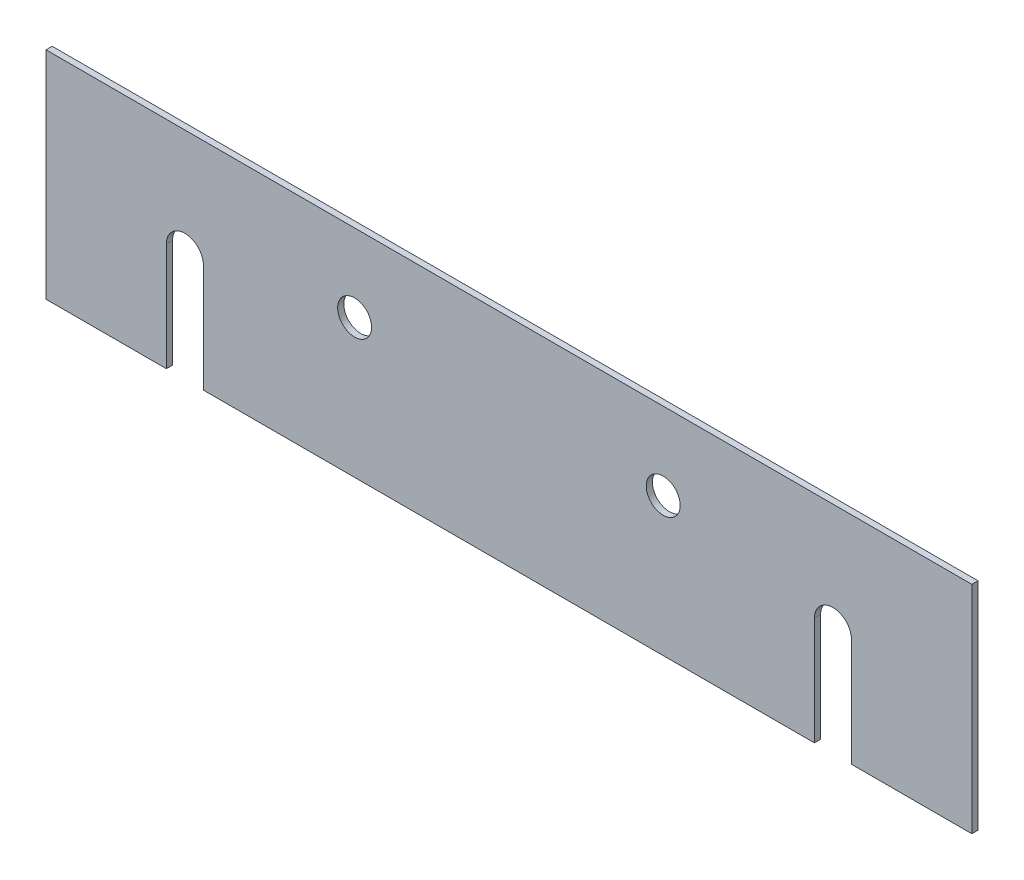
ISO-10303-21;
HEADER;
FILE_DESCRIPTION(('STEP AP214'),'2;1');
FILE_NAME('part.step','',(''),(''),'','','');
FILE_SCHEMA(('AUTOMOTIVE_DESIGN { 1 0 10303 214 1 1 1 1 }'));
ENDSEC;
DATA;
#1=APPLICATION_CONTEXT('core data for automotive mechanical design processes');
#2=APPLICATION_PROTOCOL_DEFINITION('international standard','automotive_design',2000,#1);
#3=PRODUCT_CONTEXT('',#1,'mechanical');
#4=PRODUCT('Part','Part','',(#3));
#5=PRODUCT_RELATED_PRODUCT_CATEGORY('part','',(#4));
#6=PRODUCT_DEFINITION_FORMATION('','',#4);
#7=PRODUCT_DEFINITION_CONTEXT('part definition',#1,'design');
#8=PRODUCT_DEFINITION('design','',#6,#7);
#9=PRODUCT_DEFINITION_SHAPE('','',#8);
#10=(LENGTH_UNIT() NAMED_UNIT(*) SI_UNIT(.MILLI.,.METRE.));
#11=(NAMED_UNIT(*) PLANE_ANGLE_UNIT() SI_UNIT($,.RADIAN.));
#12=(NAMED_UNIT(*) SI_UNIT($,.STERADIAN.) SOLID_ANGLE_UNIT());
#13=UNCERTAINTY_MEASURE_WITH_UNIT(LENGTH_MEASURE(1.E-05),#10,'distance_accuracy_value','');
#14=(GEOMETRIC_REPRESENTATION_CONTEXT(3) GLOBAL_UNCERTAINTY_ASSIGNED_CONTEXT((#13)) GLOBAL_UNIT_ASSIGNED_CONTEXT((#10,
#11,#12)) REPRESENTATION_CONTEXT('',''));
#15=CARTESIAN_POINT('',(0.,0.,0.));
#16=DIRECTION('',(0.,0.,1.));
#17=DIRECTION('',(1.,0.,0.));
#18=AXIS2_PLACEMENT_3D('',#15,#16,#17);
#19=CARTESIAN_POINT('',(58.1800411522634,11.4197530864197,2.));
#20=DIRECTION('',(0.,0.,1.));
#21=DIRECTION('',(1.,0.,0.));
#22=AXIS2_PLACEMENT_3D('',#19,#20,#21);
#23=PLANE('',#22);
#24=CARTESIAN_POINT('',(-96.8199588477366,21.2962962962963,2.));
#25=DIRECTION('',(0.,0.,1.));
#26=DIRECTION('',(1.,0.,0.));
#27=AXIS2_PLACEMENT_3D('',#24,#25,#26);
#28=CIRCLE('',#27,5.5);
#29=CARTESIAN_POINT('',(-91.3199588477366,21.2962962962963,2.));
#30=VERTEX_POINT('',#29);
#31=EDGE_CURVE('E157',#30,#30,#28,.T.);
#32=ORIENTED_EDGE('',*,*,#31,.F.);
#33=EDGE_LOOP('',(#32));
#34=FACE_BOUND('',#33,.T.);
#35=DIRECTION('',(0.,1.,0.));
#36=VECTOR('',#35,1.);
#37=CARTESIAN_POINT('',(103.180041152263,46.4197530864198,2.));
#38=LINE('',#37,#36);
#39=CARTESIAN_POINT('',(103.180041152263,-23.5802469135802,2.));
#40=VERTEX_POINT('',#39);
#41=CARTESIAN_POINT('',(103.180041152263,46.4197530864198,2.));
#42=VERTEX_POINT('',#41);
#43=EDGE_CURVE('E176',#40,#42,#38,.T.);
#44=ORIENTED_EDGE('',*,*,#43,.T.);
#45=DIRECTION('',(-1.,0.,0.));
#46=VECTOR('',#45,1.);
#47=CARTESIAN_POINT('',(103.180041152263,46.4197530864198,2.));
#48=LINE('',#47,#46);
#49=CARTESIAN_POINT('',(-196.819958847737,46.4197530864197,2.));
#50=VERTEX_POINT('',#49);
#51=EDGE_CURVE('E104',#42,#50,#48,.T.);
#52=ORIENTED_EDGE('',*,*,#51,.T.);
#53=DIRECTION('',(0.,-1.,0.));
#54=VECTOR('',#53,1.);
#55=CARTESIAN_POINT('',(-196.819958847737,46.4197530864197,2.));
#56=LINE('',#55,#54);
#57=CARTESIAN_POINT('',(-196.819958847737,-23.5802469135803,2.));
#58=VERTEX_POINT('',#57);
#59=EDGE_CURVE('E203',#50,#58,#56,.T.);
#60=ORIENTED_EDGE('',*,*,#59,.T.);
#61=DIRECTION('',(1.,0.,0.));
#62=VECTOR('',#61,1.);
#63=CARTESIAN_POINT('',(-157.819958847737,-23.5802469135803,2.));
#64=LINE('',#63,#62);
#65=CARTESIAN_POINT('',(-157.819958847737,-23.5802469135803,2.));
#66=VERTEX_POINT('',#65);
#67=EDGE_CURVE('E222',#58,#66,#64,.T.);
#68=ORIENTED_EDGE('',*,*,#67,.T.);
#69=DIRECTION('',(0.,1.,0.));
#70=VECTOR('',#69,1.);
#71=CARTESIAN_POINT('',(-157.819958847737,-23.5802469135803,2.));
#72=LINE('',#71,#70);
#73=CARTESIAN_POINT('',(-157.819958847737,11.4197530864197,2.));
#74=VERTEX_POINT('',#73);
#75=EDGE_CURVE('E219',#66,#74,#72,.T.);
#76=ORIENTED_EDGE('',*,*,#75,.T.);
#77=CARTESIAN_POINT('',(-151.819958847737,11.4197530864197,2.));
#78=DIRECTION('',(0.,0.,-1.));
#79=DIRECTION('',(1.,0.,0.));
#80=AXIS2_PLACEMENT_3D('',#77,#78,#79);
#81=CIRCLE('',#80,6.00000000000001);
#82=CARTESIAN_POINT('',(-145.819958847737,11.4197530864197,2.));
#83=VERTEX_POINT('',#82);
#84=EDGE_CURVE('E221',#74,#83,#81,.T.);
#85=ORIENTED_EDGE('',*,*,#84,.T.);
#86=DIRECTION('',(0.,-1.,0.));
#87=VECTOR('',#86,1.);
#88=CARTESIAN_POINT('',(-145.819958847737,-23.5802469135803,2.));
#89=LINE('',#88,#87);
#90=CARTESIAN_POINT('',(-145.819958847737,-23.5802469135803,2.));
#91=VERTEX_POINT('',#90);
#92=EDGE_CURVE('E224',#83,#91,#89,.T.);
#93=ORIENTED_EDGE('',*,*,#92,.T.);
#94=DIRECTION('',(1.,0.,0.));
#95=VECTOR('',#94,1.);
#96=CARTESIAN_POINT('',(52.1800411522634,-23.5802469135803,2.));
#97=LINE('',#96,#95);
#98=CARTESIAN_POINT('',(52.1800411522634,-23.5802469135803,2.));
#99=VERTEX_POINT('',#98);
#100=EDGE_CURVE('E230',#91,#99,#97,.T.);
#101=ORIENTED_EDGE('',*,*,#100,.T.);
#102=DIRECTION('',(0.,1.,0.));
#103=VECTOR('',#102,1.);
#104=CARTESIAN_POINT('',(52.1800411522634,-23.5802469135803,2.));
#105=LINE('',#104,#103);
#106=CARTESIAN_POINT('',(52.1800411522634,11.4197530864197,2.));
#107=VERTEX_POINT('',#106);
#108=EDGE_CURVE('E135',#99,#107,#105,.T.);
#109=ORIENTED_EDGE('',*,*,#108,.T.);
#110=CARTESIAN_POINT('',(58.1800411522634,11.4197530864197,2.));
#111=DIRECTION('',(0.,0.,-1.));
#112=DIRECTION('',(1.,0.,0.));
#113=AXIS2_PLACEMENT_3D('',#110,#111,#112);
#114=CIRCLE('',#113,6.00000000000001);
#115=CARTESIAN_POINT('',(64.1800411522634,11.4197530864197,2.));
#116=VERTEX_POINT('',#115);
#117=EDGE_CURVE('E129',#107,#116,#114,.T.);
#118=ORIENTED_EDGE('',*,*,#117,.T.);
#119=DIRECTION('',(0.,-1.,0.));
#120=VECTOR('',#119,1.);
#121=CARTESIAN_POINT('',(64.1800411522634,-23.5802469135803,2.));
#122=LINE('',#121,#120);
#123=CARTESIAN_POINT('',(64.1800411522634,-23.5802469135803,2.));
#124=VERTEX_POINT('',#123);
#125=EDGE_CURVE('E133',#116,#124,#122,.T.);
#126=ORIENTED_EDGE('',*,*,#125,.T.);
#127=DIRECTION('',(1.,0.,0.));
#128=VECTOR('',#127,1.);
#129=CARTESIAN_POINT('',(103.180041152263,-23.5802469135802,2.));
#130=LINE('',#129,#128);
#131=EDGE_CURVE('E49',#124,#40,#130,.T.);
#132=ORIENTED_EDGE('',*,*,#131,.T.);
#133=EDGE_LOOP('',(#44,#52,#60,#68,#76,#85,#93,#101,#109,#118,#126,#132));
#134=FACE_BOUND('',#133,.T.);
#135=CARTESIAN_POINT('',(3.18004115226343,21.2962962962963,2.));
#136=DIRECTION('',(0.,0.,1.));
#137=DIRECTION('',(1.,0.,0.));
#138=AXIS2_PLACEMENT_3D('',#135,#136,#137);
#139=CIRCLE('',#138,5.5);
#140=CARTESIAN_POINT('',(8.68004115226343,21.2962962962963,2.));
#141=VERTEX_POINT('',#140);
#142=EDGE_CURVE('E272',#141,#141,#139,.T.);
#143=ORIENTED_EDGE('',*,*,#142,.F.);
#144=EDGE_LOOP('',(#143));
#145=FACE_BOUND('',#144,.T.);
#146=ADVANCED_FACE('F32',(#34,#134,#145),#23,.T.);
#147=CARTESIAN_POINT('',(58.1800411522634,11.4197530864197,0.));
#148=DIRECTION('',(0.,0.,1.));
#149=DIRECTION('',(1.,0.,0.));
#150=AXIS2_PLACEMENT_3D('',#147,#148,#149);
#151=PLANE('',#150);
#152=DIRECTION('',(0.,1.,0.));
#153=VECTOR('',#152,1.);
#154=CARTESIAN_POINT('',(103.180041152263,46.4197530864198,0.));
#155=LINE('',#154,#153);
#156=CARTESIAN_POINT('',(103.180041152263,-23.5802469135802,0.));
#157=VERTEX_POINT('',#156);
#158=CARTESIAN_POINT('',(103.180041152263,46.4197530864198,0.));
#159=VERTEX_POINT('',#158);
#160=EDGE_CURVE('E153',#157,#159,#155,.T.);
#161=ORIENTED_EDGE('',*,*,#160,.F.);
#162=DIRECTION('',(1.,0.,0.));
#163=VECTOR('',#162,1.);
#164=CARTESIAN_POINT('',(103.180041152263,-23.5802469135802,0.));
#165=LINE('',#164,#163);
#166=CARTESIAN_POINT('',(64.1800411522634,-23.5802469135803,0.));
#167=VERTEX_POINT('',#166);
#168=EDGE_CURVE('E96',#167,#157,#165,.T.);
#169=ORIENTED_EDGE('',*,*,#168,.F.);
#170=DIRECTION('',(0.,-1.,0.));
#171=VECTOR('',#170,1.);
#172=CARTESIAN_POINT('',(64.1800411522634,-23.5802469135803,0.));
#173=LINE('',#172,#171);
#174=CARTESIAN_POINT('',(64.1800411522634,11.4197530864197,0.));
#175=VERTEX_POINT('',#174);
#176=EDGE_CURVE('E90',#175,#167,#173,.T.);
#177=ORIENTED_EDGE('',*,*,#176,.F.);
#178=CARTESIAN_POINT('',(58.1800411522634,11.4197530864197,0.));
#179=DIRECTION('',(0.,0.,-1.));
#180=DIRECTION('',(1.,0.,0.));
#181=AXIS2_PLACEMENT_3D('',#178,#179,#180);
#182=CIRCLE('',#181,6.00000000000001);
#183=CARTESIAN_POINT('',(52.1800411522634,11.4197530864197,0.));
#184=VERTEX_POINT('',#183);
#185=EDGE_CURVE('E143',#184,#175,#182,.T.);
#186=ORIENTED_EDGE('',*,*,#185,.F.);
#187=DIRECTION('',(0.,1.,0.));
#188=VECTOR('',#187,1.);
#189=CARTESIAN_POINT('',(52.1800411522634,-23.5802469135803,0.));
#190=LINE('',#189,#188);
#191=CARTESIAN_POINT('',(52.1800411522634,-23.5802469135803,0.));
#192=VERTEX_POINT('',#191);
#193=EDGE_CURVE('E171',#192,#184,#190,.T.);
#194=ORIENTED_EDGE('',*,*,#193,.F.);
#195=DIRECTION('',(1.,0.,0.));
#196=VECTOR('',#195,1.);
#197=CARTESIAN_POINT('',(52.1800411522634,-23.5802469135803,0.));
#198=LINE('',#197,#196);
#199=CARTESIAN_POINT('',(-145.819958847737,-23.5802469135803,0.));
#200=VERTEX_POINT('',#199);
#201=EDGE_CURVE('E169',#200,#192,#198,.T.);
#202=ORIENTED_EDGE('',*,*,#201,.F.);
#203=DIRECTION('',(0.,-1.,0.));
#204=VECTOR('',#203,1.);
#205=CARTESIAN_POINT('',(-145.819958847737,-23.5802469135803,0.));
#206=LINE('',#205,#204);
#207=CARTESIAN_POINT('',(-145.819958847737,11.4197530864197,0.));
#208=VERTEX_POINT('',#207);
#209=EDGE_CURVE('E167',#208,#200,#206,.T.);
#210=ORIENTED_EDGE('',*,*,#209,.F.);
#211=CARTESIAN_POINT('',(-151.819958847737,11.4197530864197,0.));
#212=DIRECTION('',(0.,0.,-1.));
#213=DIRECTION('',(1.,0.,0.));
#214=AXIS2_PLACEMENT_3D('',#211,#212,#213);
#215=CIRCLE('',#214,6.00000000000001);
#216=CARTESIAN_POINT('',(-157.819958847737,11.4197530864197,0.));
#217=VERTEX_POINT('',#216);
#218=EDGE_CURVE('E165',#217,#208,#215,.T.);
#219=ORIENTED_EDGE('',*,*,#218,.F.);
#220=DIRECTION('',(0.,1.,0.));
#221=VECTOR('',#220,1.);
#222=CARTESIAN_POINT('',(-157.819958847737,-23.5802469135803,0.));
#223=LINE('',#222,#221);
#224=CARTESIAN_POINT('',(-157.819958847737,-23.5802469135803,0.));
#225=VERTEX_POINT('',#224);
#226=EDGE_CURVE('E163',#225,#217,#223,.T.);
#227=ORIENTED_EDGE('',*,*,#226,.F.);
#228=DIRECTION('',(1.,0.,0.));
#229=VECTOR('',#228,1.);
#230=CARTESIAN_POINT('',(-157.819958847737,-23.5802469135803,0.));
#231=LINE('',#230,#229);
#232=CARTESIAN_POINT('',(-196.819958847737,-23.5802469135803,0.));
#233=VERTEX_POINT('',#232);
#234=EDGE_CURVE('E161',#233,#225,#231,.T.);
#235=ORIENTED_EDGE('',*,*,#234,.F.);
#236=DIRECTION('',(0.,-1.,0.));
#237=VECTOR('',#236,1.);
#238=CARTESIAN_POINT('',(-196.819958847737,46.4197530864197,0.));
#239=LINE('',#238,#237);
#240=CARTESIAN_POINT('',(-196.819958847737,46.4197530864197,0.));
#241=VERTEX_POINT('',#240);
#242=EDGE_CURVE('E159',#241,#233,#239,.T.);
#243=ORIENTED_EDGE('',*,*,#242,.F.);
#244=DIRECTION('',(-1.,0.,0.));
#245=VECTOR('',#244,1.);
#246=CARTESIAN_POINT('',(103.180041152263,46.4197530864198,0.));
#247=LINE('',#246,#245);
#248=EDGE_CURVE('E156',#159,#241,#247,.T.);
#249=ORIENTED_EDGE('',*,*,#248,.F.);
#250=EDGE_LOOP('',(#161,#169,#177,#186,#194,#202,#210,#219,#227,#235,#243,#249));
#251=FACE_BOUND('',#250,.T.);
#252=CARTESIAN_POINT('',(-96.8199588477366,21.2962962962963,0.));
#253=DIRECTION('',(0.,0.,1.));
#254=DIRECTION('',(1.,0.,0.));
#255=AXIS2_PLACEMENT_3D('',#252,#253,#254);
#256=CIRCLE('',#255,5.5);
#257=CARTESIAN_POINT('',(-91.3199588477366,21.2962962962963,0.));
#258=VERTEX_POINT('',#257);
#259=EDGE_CURVE('E278',#258,#258,#256,.T.);
#260=ORIENTED_EDGE('',*,*,#259,.T.);
#261=EDGE_LOOP('',(#260));
#262=FACE_BOUND('',#261,.T.);
#263=CARTESIAN_POINT('',(3.18004115226343,21.2962962962963,0.));
#264=DIRECTION('',(0.,0.,1.));
#265=DIRECTION('',(1.,0.,0.));
#266=AXIS2_PLACEMENT_3D('',#263,#264,#265);
#267=CIRCLE('',#266,5.5);
#268=CARTESIAN_POINT('',(8.68004115226343,21.2962962962963,0.));
#269=VERTEX_POINT('',#268);
#270=EDGE_CURVE('E275',#269,#269,#267,.T.);
#271=ORIENTED_EDGE('',*,*,#270,.T.);
#272=EDGE_LOOP('',(#271));
#273=FACE_BOUND('',#272,.T.);
#274=ADVANCED_FACE('F207',(#251,#262,#273),#151,.F.);
#275=CARTESIAN_POINT('',(103.180041152263,46.4197530864198,2.));
#276=DIRECTION('',(-1.,0.,0.));
#277=DIRECTION('',(0.,-1.,0.));
#278=AXIS2_PLACEMENT_3D('',#275,#276,#277);
#279=PLANE('',#278);
#280=ORIENTED_EDGE('',*,*,#160,.T.);
#281=DIRECTION('',(0.,0.,-1.));
#282=VECTOR('',#281,1.);
#283=CARTESIAN_POINT('',(103.180041152263,46.4197530864198,2.));
#284=LINE('',#283,#282);
#285=EDGE_CURVE('E11',#42,#159,#284,.T.);
#286=ORIENTED_EDGE('',*,*,#285,.F.);
#287=ORIENTED_EDGE('',*,*,#43,.F.);
#288=DIRECTION('',(0.,0.,-1.));
#289=VECTOR('',#288,1.);
#290=CARTESIAN_POINT('',(103.180041152263,-23.5802469135802,2.));
#291=LINE('',#290,#289);
#292=EDGE_CURVE('E149',#40,#157,#291,.T.);
#293=ORIENTED_EDGE('',*,*,#292,.T.);
#294=EDGE_LOOP('',(#280,#286,#287,#293));
#295=FACE_BOUND('',#294,.T.);
#296=ADVANCED_FACE('F34',(#295),#279,.F.);
#297=CARTESIAN_POINT('',(103.180041152263,46.4197530864198,2.));
#298=DIRECTION('',(0.,-1.,0.));
#299=DIRECTION('',(1.,0.,0.));
#300=AXIS2_PLACEMENT_3D('',#297,#298,#299);
#301=PLANE('',#300);
#302=ORIENTED_EDGE('',*,*,#248,.T.);
#303=DIRECTION('',(0.,0.,-1.));
#304=VECTOR('',#303,1.);
#305=CARTESIAN_POINT('',(-196.819958847737,46.4197530864197,2.));
#306=LINE('',#305,#304);
#307=EDGE_CURVE('E41',#50,#241,#306,.T.);
#308=ORIENTED_EDGE('',*,*,#307,.F.);
#309=ORIENTED_EDGE('',*,*,#51,.F.);
#310=ORIENTED_EDGE('',*,*,#285,.T.);
#311=EDGE_LOOP('',(#302,#308,#309,#310));
#312=FACE_BOUND('',#311,.T.);
#313=ADVANCED_FACE('F371',(#312),#301,.F.);
#314=CARTESIAN_POINT('',(-196.819958847737,46.4197530864197,2.));
#315=DIRECTION('',(1.,0.,0.));
#316=DIRECTION('',(0.,0.,-1.));
#317=AXIS2_PLACEMENT_3D('',#314,#315,#316);
#318=PLANE('',#317);
#319=ORIENTED_EDGE('',*,*,#242,.T.);
#320=DIRECTION('',(0.,0.,-1.));
#321=VECTOR('',#320,1.);
#322=CARTESIAN_POINT('',(-196.819958847737,-23.5802469135803,2.));
#323=LINE('',#322,#321);
#324=EDGE_CURVE('E195',#58,#233,#323,.T.);
#325=ORIENTED_EDGE('',*,*,#324,.F.);
#326=ORIENTED_EDGE('',*,*,#59,.F.);
#327=ORIENTED_EDGE('',*,*,#307,.T.);
#328=EDGE_LOOP('',(#319,#325,#326,#327));
#329=FACE_BOUND('',#328,.T.);
#330=ADVANCED_FACE('F201',(#329),#318,.F.);
#331=CARTESIAN_POINT('',(-157.819958847737,-23.5802469135803,2.));
#332=DIRECTION('',(0.,1.,0.));
#333=DIRECTION('',(-1.,0.,0.));
#334=AXIS2_PLACEMENT_3D('',#331,#332,#333);
#335=PLANE('',#334);
#336=ORIENTED_EDGE('',*,*,#234,.T.);
#337=DIRECTION('',(0.,0.,-1.));
#338=VECTOR('',#337,1.);
#339=CARTESIAN_POINT('',(-157.819958847737,-23.5802469135803,2.));
#340=LINE('',#339,#338);
#341=EDGE_CURVE('E192',#66,#225,#340,.T.);
#342=ORIENTED_EDGE('',*,*,#341,.F.);
#343=ORIENTED_EDGE('',*,*,#67,.F.);
#344=ORIENTED_EDGE('',*,*,#324,.T.);
#345=EDGE_LOOP('',(#336,#342,#343,#344));
#346=FACE_BOUND('',#345,.T.);
#347=ADVANCED_FACE('F213',(#346),#335,.F.);
#348=CARTESIAN_POINT('',(-157.819958847737,-23.5802469135803,2.));
#349=DIRECTION('',(-1.,0.,0.));
#350=DIRECTION('',(0.,0.,1.));
#351=AXIS2_PLACEMENT_3D('',#348,#349,#350);
#352=PLANE('',#351);
#353=ORIENTED_EDGE('',*,*,#226,.T.);
#354=DIRECTION('',(0.,0.,-1.));
#355=VECTOR('',#354,1.);
#356=CARTESIAN_POINT('',(-157.819958847737,11.4197530864197,2.));
#357=LINE('',#356,#355);
#358=EDGE_CURVE('E189',#74,#217,#357,.T.);
#359=ORIENTED_EDGE('',*,*,#358,.F.);
#360=ORIENTED_EDGE('',*,*,#75,.F.);
#361=ORIENTED_EDGE('',*,*,#341,.T.);
#362=EDGE_LOOP('',(#353,#359,#360,#361));
#363=FACE_BOUND('',#362,.T.);
#364=ADVANCED_FACE('F217',(#363),#352,.F.);
#365=CARTESIAN_POINT('',(-151.819958847737,11.4197530864197,2.));
#366=DIRECTION('',(0.,0.,-1.));
#367=DIRECTION('',(-1.,0.,0.));
#368=AXIS2_PLACEMENT_3D('',#365,#366,#367);
#369=CYLINDRICAL_SURFACE('',#368,6.00000000000001);
#370=ORIENTED_EDGE('',*,*,#218,.T.);
#371=DIRECTION('',(0.,0.,-1.));
#372=VECTOR('',#371,1.);
#373=CARTESIAN_POINT('',(-145.819958847737,11.4197530864197,2.));
#374=LINE('',#373,#372);
#375=EDGE_CURVE('E186',#83,#208,#374,.T.);
#376=ORIENTED_EDGE('',*,*,#375,.F.);
#377=ORIENTED_EDGE('',*,*,#84,.F.);
#378=ORIENTED_EDGE('',*,*,#358,.T.);
#379=EDGE_LOOP('',(#370,#376,#377,#378));
#380=FACE_BOUND('',#379,.T.);
#381=ADVANCED_FACE('F336',(#380),#369,.F.);
#382=CARTESIAN_POINT('',(-145.819958847737,-23.5802469135803,2.));
#383=DIRECTION('',(1.,0.,0.));
#384=DIRECTION('',(0.,0.,-1.));
#385=AXIS2_PLACEMENT_3D('',#382,#383,#384);
#386=PLANE('',#385);
#387=ORIENTED_EDGE('',*,*,#209,.T.);
#388=DIRECTION('',(0.,0.,-1.));
#389=VECTOR('',#388,1.);
#390=CARTESIAN_POINT('',(-145.819958847737,-23.5802469135803,2.));
#391=LINE('',#390,#389);
#392=EDGE_CURVE('E183',#91,#200,#391,.T.);
#393=ORIENTED_EDGE('',*,*,#392,.F.);
#394=ORIENTED_EDGE('',*,*,#92,.F.);
#395=ORIENTED_EDGE('',*,*,#375,.T.);
#396=EDGE_LOOP('',(#387,#393,#394,#395));
#397=FACE_BOUND('',#396,.T.);
#398=ADVANCED_FACE('F327',(#397),#386,.F.);
#399=CARTESIAN_POINT('',(52.1800411522634,-23.5802469135803,2.));
#400=DIRECTION('',(0.,1.,0.));
#401=DIRECTION('',(-1.,0.,0.));
#402=AXIS2_PLACEMENT_3D('',#399,#400,#401);
#403=PLANE('',#402);
#404=ORIENTED_EDGE('',*,*,#201,.T.);
#405=DIRECTION('',(0.,0.,-1.));
#406=VECTOR('',#405,1.);
#407=CARTESIAN_POINT('',(52.1800411522634,-23.5802469135803,2.));
#408=LINE('',#407,#406);
#409=EDGE_CURVE('E180',#99,#192,#408,.T.);
#410=ORIENTED_EDGE('',*,*,#409,.F.);
#411=ORIENTED_EDGE('',*,*,#100,.F.);
#412=ORIENTED_EDGE('',*,*,#392,.T.);
#413=EDGE_LOOP('',(#404,#410,#411,#412));
#414=FACE_BOUND('',#413,.T.);
#415=ADVANCED_FACE('F236',(#414),#403,.F.);
#416=CARTESIAN_POINT('',(52.1800411522634,-23.5802469135803,2.));
#417=DIRECTION('',(-1.,0.,0.));
#418=DIRECTION('',(0.,-1.,0.));
#419=AXIS2_PLACEMENT_3D('',#416,#417,#418);
#420=PLANE('',#419);
#421=ORIENTED_EDGE('',*,*,#193,.T.);
#422=DIRECTION('',(0.,0.,-1.));
#423=VECTOR('',#422,1.);
#424=CARTESIAN_POINT('',(52.1800411522634,11.4197530864197,2.));
#425=LINE('',#424,#423);
#426=EDGE_CURVE('E144',#107,#184,#425,.T.);
#427=ORIENTED_EDGE('',*,*,#426,.F.);
#428=ORIENTED_EDGE('',*,*,#108,.F.);
#429=ORIENTED_EDGE('',*,*,#409,.T.);
#430=EDGE_LOOP('',(#421,#427,#428,#429));
#431=FACE_BOUND('',#430,.T.);
#432=ADVANCED_FACE('F240',(#431),#420,.F.);
#433=CARTESIAN_POINT('',(58.1800411522634,11.4197530864197,2.));
#434=DIRECTION('',(0.,0.,-1.));
#435=DIRECTION('',(-1.,0.,0.));
#436=AXIS2_PLACEMENT_3D('',#433,#434,#435);
#437=CYLINDRICAL_SURFACE('',#436,6.00000000000001);
#438=ORIENTED_EDGE('',*,*,#185,.T.);
#439=DIRECTION('',(0.,0.,-1.));
#440=VECTOR('',#439,1.);
#441=CARTESIAN_POINT('',(64.1800411522634,11.4197530864197,2.));
#442=LINE('',#441,#440);
#443=EDGE_CURVE('E140',#116,#175,#442,.T.);
#444=ORIENTED_EDGE('',*,*,#443,.F.);
#445=ORIENTED_EDGE('',*,*,#117,.F.);
#446=ORIENTED_EDGE('',*,*,#426,.T.);
#447=EDGE_LOOP('',(#438,#444,#445,#446));
#448=FACE_BOUND('',#447,.T.);
#449=ADVANCED_FACE('F141',(#448),#437,.F.);
#450=CARTESIAN_POINT('',(64.1800411522634,-23.5802469135803,2.));
#451=DIRECTION('',(1.,0.,0.));
#452=DIRECTION('',(0.,0.,-1.));
#453=AXIS2_PLACEMENT_3D('',#450,#451,#452);
#454=PLANE('',#453);
#455=ORIENTED_EDGE('',*,*,#176,.T.);
#456=DIRECTION('',(0.,0.,-1.));
#457=VECTOR('',#456,1.);
#458=CARTESIAN_POINT('',(64.1800411522634,-23.5802469135803,2.));
#459=LINE('',#458,#457);
#460=EDGE_CURVE('E145',#124,#167,#459,.T.);
#461=ORIENTED_EDGE('',*,*,#460,.F.);
#462=ORIENTED_EDGE('',*,*,#125,.F.);
#463=ORIENTED_EDGE('',*,*,#443,.T.);
#464=EDGE_LOOP('',(#455,#461,#462,#463));
#465=FACE_BOUND('',#464,.T.);
#466=ADVANCED_FACE('F147',(#465),#454,.F.);
#467=CARTESIAN_POINT('',(103.180041152263,-23.5802469135802,2.));
#468=DIRECTION('',(0.,1.,0.));
#469=DIRECTION('',(-1.,0.,0.));
#470=AXIS2_PLACEMENT_3D('',#467,#468,#469);
#471=PLANE('',#470);
#472=ORIENTED_EDGE('',*,*,#168,.T.);
#473=ORIENTED_EDGE('',*,*,#292,.F.);
#474=ORIENTED_EDGE('',*,*,#131,.F.);
#475=ORIENTED_EDGE('',*,*,#460,.T.);
#476=EDGE_LOOP('',(#472,#473,#474,#475));
#477=FACE_BOUND('',#476,.T.);
#478=ADVANCED_FACE('F244',(#477),#471,.F.);
#479=CARTESIAN_POINT('',(-96.8199588477366,21.2962962962963,2.));
#480=DIRECTION('',(0.,0.,-1.));
#481=DIRECTION('',(-1.,0.,0.));
#482=AXIS2_PLACEMENT_3D('',#479,#480,#481);
#483=CYLINDRICAL_SURFACE('',#482,5.5);
#484=ORIENTED_EDGE('',*,*,#31,.T.);
#485=EDGE_LOOP('',(#484));
#486=FACE_BOUND('',#485,.T.);
#487=ORIENTED_EDGE('',*,*,#259,.F.);
#488=EDGE_LOOP('',(#487));
#489=FACE_BOUND('',#488,.T.);
#490=ADVANCED_FACE('F246',(#486,#489),#483,.F.);
#491=CARTESIAN_POINT('',(3.18004115226343,21.2962962962963,2.));
#492=DIRECTION('',(0.,0.,-1.));
#493=DIRECTION('',(-1.,0.,0.));
#494=AXIS2_PLACEMENT_3D('',#491,#492,#493);
#495=CYLINDRICAL_SURFACE('',#494,5.5);
#496=ORIENTED_EDGE('',*,*,#142,.T.);
#497=EDGE_LOOP('',(#496));
#498=FACE_BOUND('',#497,.T.);
#499=ORIENTED_EDGE('',*,*,#270,.F.);
#500=EDGE_LOOP('',(#499));
#501=FACE_BOUND('',#500,.T.);
#502=ADVANCED_FACE('F252',(#498,#501),#495,.F.);
#503=CLOSED_SHELL('',(#146,#274,#296,#313,#330,#347,#364,#381,#398,#415,#432,#449,#466,#478,
#490,#502));
#504=MANIFOLD_SOLID_BREP('B2',#503);
#505=ADVANCED_BREP_SHAPE_REPRESENTATION('',(#18,#504),#14);
#506=SHAPE_DEFINITION_REPRESENTATION(#9,#505);
ENDSEC;
END-ISO-10303-21;
